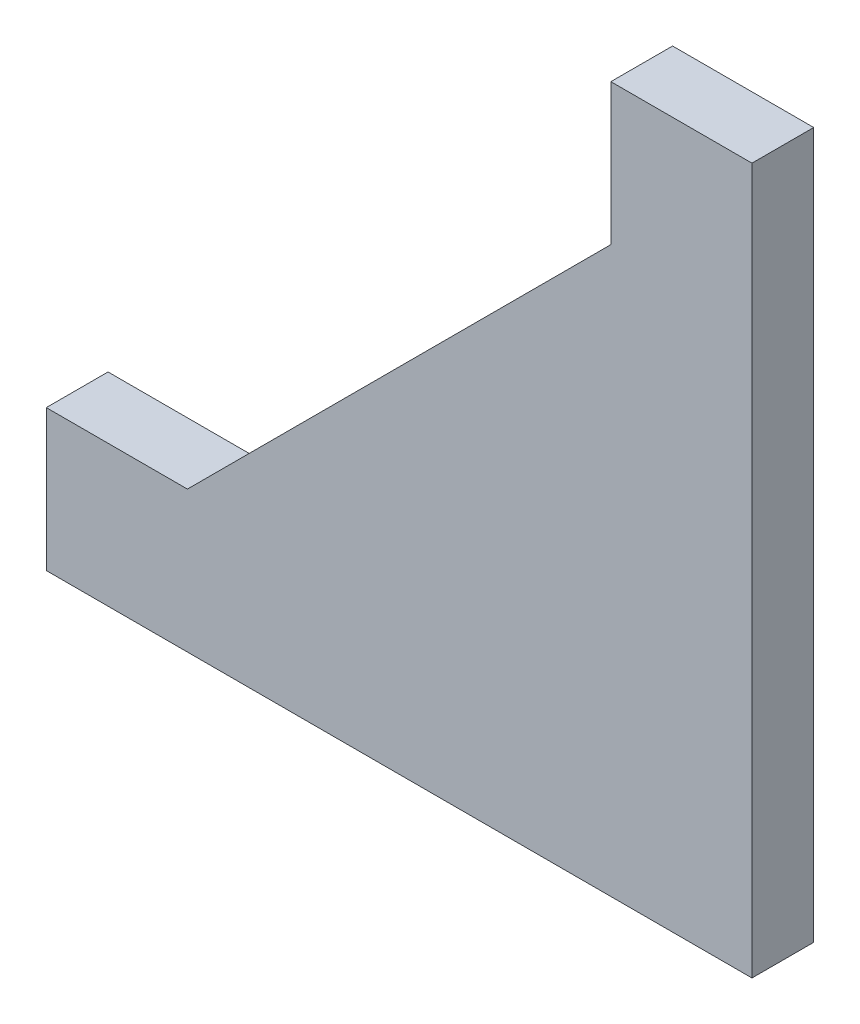
ISO-10303-21;
HEADER;
FILE_DESCRIPTION(('STEP AP214'),'2;1');
FILE_NAME('part.step','',(''),(''),'','','');
FILE_SCHEMA(('AUTOMOTIVE_DESIGN { 1 0 10303 214 1 1 1 1 }'));
ENDSEC;
DATA;
#1=APPLICATION_CONTEXT('core data for automotive mechanical design processes');
#2=APPLICATION_PROTOCOL_DEFINITION('international standard','automotive_design',2000,#1);
#3=PRODUCT_CONTEXT('',#1,'mechanical');
#4=PRODUCT('Part','Part','',(#3));
#5=PRODUCT_RELATED_PRODUCT_CATEGORY('part','',(#4));
#6=PRODUCT_DEFINITION_FORMATION('','',#4);
#7=PRODUCT_DEFINITION_CONTEXT('part definition',#1,'design');
#8=PRODUCT_DEFINITION('design','',#6,#7);
#9=PRODUCT_DEFINITION_SHAPE('','',#8);
#10=(LENGTH_UNIT() NAMED_UNIT(*) SI_UNIT(.MILLI.,.METRE.));
#11=(NAMED_UNIT(*) PLANE_ANGLE_UNIT() SI_UNIT($,.RADIAN.));
#12=(NAMED_UNIT(*) SI_UNIT($,.STERADIAN.) SOLID_ANGLE_UNIT());
#13=UNCERTAINTY_MEASURE_WITH_UNIT(LENGTH_MEASURE(1.E-05),#10,'distance_accuracy_value','');
#14=(GEOMETRIC_REPRESENTATION_CONTEXT(3) GLOBAL_UNCERTAINTY_ASSIGNED_CONTEXT((#13)) GLOBAL_UNIT_ASSIGNED_CONTEXT((#10,
#11,#12)) REPRESENTATION_CONTEXT('',''));
#15=CARTESIAN_POINT('',(0.,0.,0.));
#16=DIRECTION('',(0.,0.,1.));
#17=DIRECTION('',(1.,0.,0.));
#18=AXIS2_PLACEMENT_3D('',#15,#16,#17);
#19=CARTESIAN_POINT('',(0.,0.,3.5));
#20=DIRECTION('',(-1.,0.,0.));
#21=DIRECTION('',(0.,0.,1.));
#22=AXIS2_PLACEMENT_3D('',#19,#20,#21);
#23=PLANE('',#22);
#24=DIRECTION('',(0.,1.,0.));
#25=VECTOR('',#24,1.);
#26=CARTESIAN_POINT('',(0.,0.,0.));
#27=LINE('',#26,#25);
#28=CARTESIAN_POINT('',(0.,0.,0.));
#29=VERTEX_POINT('',#28);
#30=CARTESIAN_POINT('',(0.,40.,0.));
#31=VERTEX_POINT('',#30);
#32=EDGE_CURVE('E125',#29,#31,#27,.T.);
#33=ORIENTED_EDGE('',*,*,#32,.T.);
#34=DIRECTION('',(0.,0.,-1.));
#35=VECTOR('',#34,1.);
#36=CARTESIAN_POINT('',(0.,40.,3.5));
#37=LINE('',#36,#35);
#38=CARTESIAN_POINT('',(0.,40.,3.5));
#39=VERTEX_POINT('',#38);
#40=EDGE_CURVE('E11',#39,#31,#37,.T.);
#41=ORIENTED_EDGE('',*,*,#40,.F.);
#42=DIRECTION('',(0.,1.,0.));
#43=VECTOR('',#42,1.);
#44=CARTESIAN_POINT('',(0.,0.,3.5));
#45=LINE('',#44,#43);
#46=CARTESIAN_POINT('',(0.,0.,3.5));
#47=VERTEX_POINT('',#46);
#48=EDGE_CURVE('E137',#47,#39,#45,.T.);
#49=ORIENTED_EDGE('',*,*,#48,.F.);
#50=DIRECTION('',(0.,0.,-1.));
#51=VECTOR('',#50,1.);
#52=CARTESIAN_POINT('',(0.,0.,3.5));
#53=LINE('',#52,#51);
#54=EDGE_CURVE('E121',#47,#29,#53,.T.);
#55=ORIENTED_EDGE('',*,*,#54,.T.);
#56=EDGE_LOOP('',(#33,#41,#49,#55));
#57=FACE_BOUND('',#56,.T.);
#58=ADVANCED_FACE('F35',(#57),#23,.F.);
#59=CARTESIAN_POINT('',(0.,40.,3.5));
#60=DIRECTION('',(0.,-1.,0.));
#61=DIRECTION('',(0.,0.,-1.));
#62=AXIS2_PLACEMENT_3D('',#59,#60,#61);
#63=PLANE('',#62);
#64=DIRECTION('',(-1.,0.,0.));
#65=VECTOR('',#64,1.);
#66=CARTESIAN_POINT('',(0.,40.,0.));
#67=LINE('',#66,#65);
#68=CARTESIAN_POINT('',(-8.,40.,0.));
#69=VERTEX_POINT('',#68);
#70=EDGE_CURVE('E128',#31,#69,#67,.T.);
#71=ORIENTED_EDGE('',*,*,#70,.T.);
#72=DIRECTION('',(0.,0.,-1.));
#73=VECTOR('',#72,1.);
#74=CARTESIAN_POINT('',(-8.,40.,3.5));
#75=LINE('',#74,#73);
#76=CARTESIAN_POINT('',(-8.,40.,3.5));
#77=VERTEX_POINT('',#76);
#78=EDGE_CURVE('E43',#77,#69,#75,.T.);
#79=ORIENTED_EDGE('',*,*,#78,.F.);
#80=DIRECTION('',(-1.,0.,0.));
#81=VECTOR('',#80,1.);
#82=CARTESIAN_POINT('',(0.,40.,3.5));
#83=LINE('',#82,#81);
#84=EDGE_CURVE('E91',#39,#77,#83,.T.);
#85=ORIENTED_EDGE('',*,*,#84,.F.);
#86=ORIENTED_EDGE('',*,*,#40,.T.);
#87=EDGE_LOOP('',(#71,#79,#85,#86));
#88=FACE_BOUND('',#87,.T.);
#89=ADVANCED_FACE('F162',(#88),#63,.F.);
#90=CARTESIAN_POINT('',(-8.,40.,3.5));
#91=DIRECTION('',(1.,0.,0.));
#92=DIRECTION('',(0.,1.,0.));
#93=AXIS2_PLACEMENT_3D('',#90,#91,#92);
#94=PLANE('',#93);
#95=DIRECTION('',(0.,-1.,0.));
#96=VECTOR('',#95,1.);
#97=CARTESIAN_POINT('',(-8.,40.,0.));
#98=LINE('',#97,#96);
#99=CARTESIAN_POINT('',(-8.,32.,0.));
#100=VERTEX_POINT('',#99);
#101=EDGE_CURVE('E130',#69,#100,#98,.T.);
#102=ORIENTED_EDGE('',*,*,#101,.T.);
#103=DIRECTION('',(0.,0.,-1.));
#104=VECTOR('',#103,1.);
#105=CARTESIAN_POINT('',(-8.,32.,3.5));
#106=LINE('',#105,#104);
#107=CARTESIAN_POINT('',(-8.,32.,3.5));
#108=VERTEX_POINT('',#107);
#109=EDGE_CURVE('E141',#108,#100,#106,.T.);
#110=ORIENTED_EDGE('',*,*,#109,.F.);
#111=DIRECTION('',(0.,-1.,0.));
#112=VECTOR('',#111,1.);
#113=CARTESIAN_POINT('',(-8.,40.,3.5));
#114=LINE('',#113,#112);
#115=EDGE_CURVE('E149',#77,#108,#114,.T.);
#116=ORIENTED_EDGE('',*,*,#115,.F.);
#117=ORIENTED_EDGE('',*,*,#78,.T.);
#118=EDGE_LOOP('',(#102,#110,#116,#117));
#119=FACE_BOUND('',#118,.T.);
#120=ADVANCED_FACE('F147',(#119),#94,.F.);
#121=CARTESIAN_POINT('',(-8.,32.,3.5));
#122=DIRECTION('',(0.707106781186548,-0.707106781186547,0.));
#123=DIRECTION('',(0.707106781186547,0.707106781186548,0.));
#124=AXIS2_PLACEMENT_3D('',#121,#122,#123);
#125=PLANE('',#124);
#126=DIRECTION('',(-0.707106781186547,-0.707106781186548,0.));
#127=VECTOR('',#126,1.);
#128=CARTESIAN_POINT('',(-8.,32.,0.));
#129=LINE('',#128,#127);
#130=CARTESIAN_POINT('',(-32.,7.99999999999999,0.));
#131=VERTEX_POINT('',#130);
#132=EDGE_CURVE('E132',#100,#131,#129,.T.);
#133=ORIENTED_EDGE('',*,*,#132,.T.);
#134=DIRECTION('',(0.,0.,-1.));
#135=VECTOR('',#134,1.);
#136=CARTESIAN_POINT('',(-32.,7.99999999999999,3.5));
#137=LINE('',#136,#135);
#138=CARTESIAN_POINT('',(-32.,7.99999999999999,3.5));
#139=VERTEX_POINT('',#138);
#140=EDGE_CURVE('E116',#139,#131,#137,.T.);
#141=ORIENTED_EDGE('',*,*,#140,.F.);
#142=DIRECTION('',(-0.707106781186547,-0.707106781186548,0.));
#143=VECTOR('',#142,1.);
#144=CARTESIAN_POINT('',(-8.,32.,3.5));
#145=LINE('',#144,#143);
#146=EDGE_CURVE('E107',#108,#139,#145,.T.);
#147=ORIENTED_EDGE('',*,*,#146,.F.);
#148=ORIENTED_EDGE('',*,*,#109,.T.);
#149=EDGE_LOOP('',(#133,#141,#147,#148));
#150=FACE_BOUND('',#149,.T.);
#151=ADVANCED_FACE('F155',(#150),#125,.F.);
#152=CARTESIAN_POINT('',(-40.,7.99999999999999,3.5));
#153=DIRECTION('',(0.,-1.,0.));
#154=DIRECTION('',(0.,0.,-1.));
#155=AXIS2_PLACEMENT_3D('',#152,#153,#154);
#156=PLANE('',#155);
#157=DIRECTION('',(-1.,0.,0.));
#158=VECTOR('',#157,1.);
#159=CARTESIAN_POINT('',(-40.,7.99999999999999,0.));
#160=LINE('',#159,#158);
#161=CARTESIAN_POINT('',(-40.,7.99999999999999,0.));
#162=VERTEX_POINT('',#161);
#163=EDGE_CURVE('E115',#131,#162,#160,.T.);
#164=ORIENTED_EDGE('',*,*,#163,.T.);
#165=DIRECTION('',(0.,0.,-1.));
#166=VECTOR('',#165,1.);
#167=CARTESIAN_POINT('',(-40.,7.99999999999999,3.5));
#168=LINE('',#167,#166);
#169=CARTESIAN_POINT('',(-40.,7.99999999999999,3.5));
#170=VERTEX_POINT('',#169);
#171=EDGE_CURVE('E112',#170,#162,#168,.T.);
#172=ORIENTED_EDGE('',*,*,#171,.F.);
#173=DIRECTION('',(-1.,0.,0.));
#174=VECTOR('',#173,1.);
#175=CARTESIAN_POINT('',(-40.,7.99999999999999,3.5));
#176=LINE('',#175,#174);
#177=EDGE_CURVE('E101',#139,#170,#176,.T.);
#178=ORIENTED_EDGE('',*,*,#177,.F.);
#179=ORIENTED_EDGE('',*,*,#140,.T.);
#180=EDGE_LOOP('',(#164,#172,#178,#179));
#181=FACE_BOUND('',#180,.T.);
#182=ADVANCED_FACE('F113',(#181),#156,.F.);
#183=CARTESIAN_POINT('',(-40.,0.,3.5));
#184=DIRECTION('',(1.,0.,0.));
#185=DIRECTION('',(0.,0.,-1.));
#186=AXIS2_PLACEMENT_3D('',#183,#184,#185);
#187=PLANE('',#186);
#188=DIRECTION('',(0.,-1.,0.));
#189=VECTOR('',#188,1.);
#190=CARTESIAN_POINT('',(-40.,0.,0.));
#191=LINE('',#190,#189);
#192=CARTESIAN_POINT('',(-40.,0.,0.));
#193=VERTEX_POINT('',#192);
#194=EDGE_CURVE('E77',#162,#193,#191,.T.);
#195=ORIENTED_EDGE('',*,*,#194,.T.);
#196=DIRECTION('',(0.,0.,-1.));
#197=VECTOR('',#196,1.);
#198=CARTESIAN_POINT('',(-40.,0.,3.5));
#199=LINE('',#198,#197);
#200=CARTESIAN_POINT('',(-40.,0.,3.5));
#201=VERTEX_POINT('',#200);
#202=EDGE_CURVE('E117',#201,#193,#199,.T.);
#203=ORIENTED_EDGE('',*,*,#202,.F.);
#204=DIRECTION('',(0.,-1.,0.));
#205=VECTOR('',#204,1.);
#206=CARTESIAN_POINT('',(-40.,0.,3.5));
#207=LINE('',#206,#205);
#208=EDGE_CURVE('E105',#170,#201,#207,.T.);
#209=ORIENTED_EDGE('',*,*,#208,.F.);
#210=ORIENTED_EDGE('',*,*,#171,.T.);
#211=EDGE_LOOP('',(#195,#203,#209,#210));
#212=FACE_BOUND('',#211,.T.);
#213=ADVANCED_FACE('F119',(#212),#187,.F.);
#214=CARTESIAN_POINT('',(0.,0.,3.5));
#215=DIRECTION('',(0.,1.,0.));
#216=DIRECTION('',(-1.,0.,0.));
#217=AXIS2_PLACEMENT_3D('',#214,#215,#216);
#218=PLANE('',#217);
#219=DIRECTION('',(1.,0.,0.));
#220=VECTOR('',#219,1.);
#221=CARTESIAN_POINT('',(0.,0.,0.));
#222=LINE('',#221,#220);
#223=EDGE_CURVE('E83',#193,#29,#222,.T.);
#224=ORIENTED_EDGE('',*,*,#223,.T.);
#225=ORIENTED_EDGE('',*,*,#54,.F.);
#226=DIRECTION('',(1.,0.,0.));
#227=VECTOR('',#226,1.);
#228=CARTESIAN_POINT('',(0.,0.,3.5));
#229=LINE('',#228,#227);
#230=EDGE_CURVE('E51',#201,#47,#229,.T.);
#231=ORIENTED_EDGE('',*,*,#230,.F.);
#232=ORIENTED_EDGE('',*,*,#202,.T.);
#233=EDGE_LOOP('',(#224,#225,#231,#232));
#234=FACE_BOUND('',#233,.T.);
#235=ADVANCED_FACE('F176',(#234),#218,.F.);
#236=CARTESIAN_POINT('',(0.,0.,3.5));
#237=DIRECTION('',(0.,0.,1.));
#238=DIRECTION('',(1.,0.,0.));
#239=AXIS2_PLACEMENT_3D('',#236,#237,#238);
#240=PLANE('',#239);
#241=ORIENTED_EDGE('',*,*,#48,.T.);
#242=ORIENTED_EDGE('',*,*,#84,.T.);
#243=ORIENTED_EDGE('',*,*,#115,.T.);
#244=ORIENTED_EDGE('',*,*,#146,.T.);
#245=ORIENTED_EDGE('',*,*,#177,.T.);
#246=ORIENTED_EDGE('',*,*,#208,.T.);
#247=ORIENTED_EDGE('',*,*,#230,.T.);
#248=EDGE_LOOP('',(#241,#242,#243,#244,#245,#246,#247));
#249=FACE_BOUND('',#248,.T.);
#250=ADVANCED_FACE('F103',(#249),#240,.T.);
#251=CARTESIAN_POINT('',(0.,0.,0.));
#252=DIRECTION('',(0.,0.,1.));
#253=DIRECTION('',(1.,0.,0.));
#254=AXIS2_PLACEMENT_3D('',#251,#252,#253);
#255=PLANE('',#254);
#256=ORIENTED_EDGE('',*,*,#32,.F.);
#257=ORIENTED_EDGE('',*,*,#223,.F.);
#258=ORIENTED_EDGE('',*,*,#194,.F.);
#259=ORIENTED_EDGE('',*,*,#163,.F.);
#260=ORIENTED_EDGE('',*,*,#132,.F.);
#261=ORIENTED_EDGE('',*,*,#101,.F.);
#262=ORIENTED_EDGE('',*,*,#70,.F.);
#263=EDGE_LOOP('',(#256,#257,#258,#259,#260,#261,#262));
#264=FACE_BOUND('',#263,.T.);
#265=ADVANCED_FACE('F153',(#264),#255,.F.);
#266=CLOSED_SHELL('',(#58,#89,#120,#151,#182,#213,#235,#250,#265));
#267=MANIFOLD_SOLID_BREP('B2',#266);
#268=ADVANCED_BREP_SHAPE_REPRESENTATION('',(#18,#267),#14);
#269=SHAPE_DEFINITION_REPRESENTATION(#9,#268);
ENDSEC;
END-ISO-10303-21;
